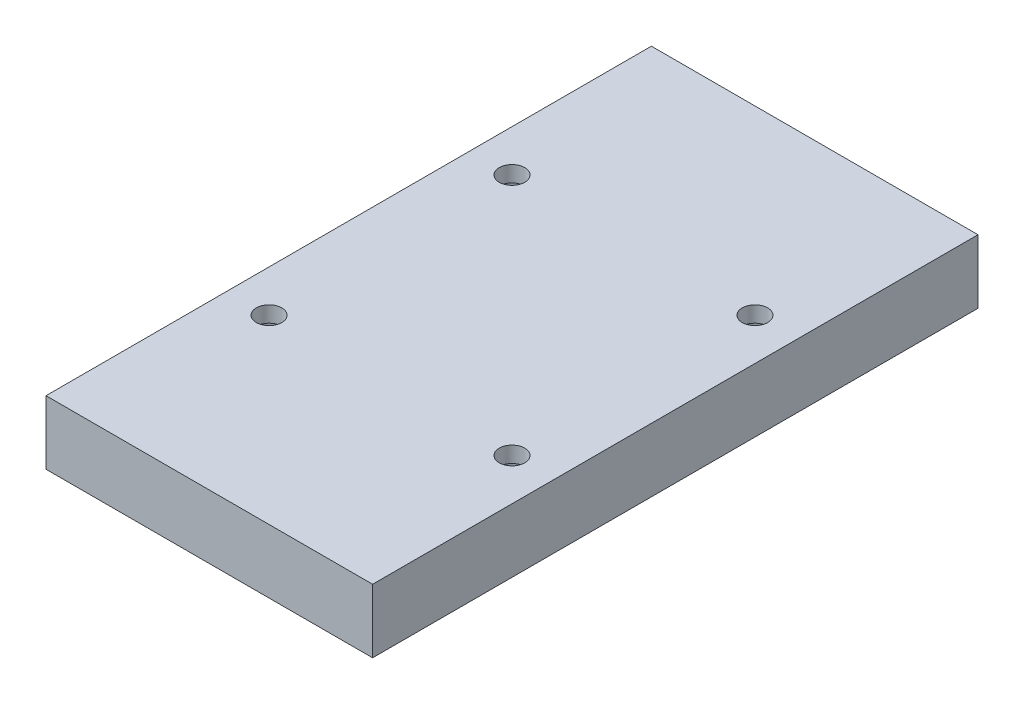
ISO-10303-21;
HEADER;
FILE_DESCRIPTION(('STEP AP214'),'2;1');
FILE_NAME('part.step','',(''),(''),'','','');
FILE_SCHEMA(('AUTOMOTIVE_DESIGN { 1 0 10303 214 1 1 1 1 }'));
ENDSEC;
DATA;
#1=APPLICATION_CONTEXT('core data for automotive mechanical design processes');
#2=APPLICATION_PROTOCOL_DEFINITION('international standard','automotive_design',2000,#1);
#3=PRODUCT_CONTEXT('',#1,'mechanical');
#4=PRODUCT('Part','Part','',(#3));
#5=PRODUCT_RELATED_PRODUCT_CATEGORY('part','',(#4));
#6=PRODUCT_DEFINITION_FORMATION('','',#4);
#7=PRODUCT_DEFINITION_CONTEXT('part definition',#1,'design');
#8=PRODUCT_DEFINITION('design','',#6,#7);
#9=PRODUCT_DEFINITION_SHAPE('','',#8);
#10=(LENGTH_UNIT() NAMED_UNIT(*) SI_UNIT(.MILLI.,.METRE.));
#11=(NAMED_UNIT(*) PLANE_ANGLE_UNIT() SI_UNIT($,.RADIAN.));
#12=(NAMED_UNIT(*) SI_UNIT($,.STERADIAN.) SOLID_ANGLE_UNIT());
#13=UNCERTAINTY_MEASURE_WITH_UNIT(LENGTH_MEASURE(1.E-05),#10,'distance_accuracy_value','');
#14=(GEOMETRIC_REPRESENTATION_CONTEXT(3) GLOBAL_UNCERTAINTY_ASSIGNED_CONTEXT((#13)) GLOBAL_UNIT_ASSIGNED_CONTEXT((#10,
#11,#12)) REPRESENTATION_CONTEXT('',''));
#15=CARTESIAN_POINT('',(0.,0.,0.));
#16=DIRECTION('',(0.,0.,1.));
#17=DIRECTION('',(1.,0.,0.));
#18=AXIS2_PLACEMENT_3D('',#15,#16,#17);
#19=CARTESIAN_POINT('',(17.5,0.,35.));
#20=DIRECTION('',(-1.,0.,0.));
#21=DIRECTION('',(0.,0.,1.));
#22=AXIS2_PLACEMENT_3D('',#19,#20,#21);
#23=PLANE('',#22);
#24=DIRECTION('',(0.,0.,-1.));
#25=VECTOR('',#24,1.);
#26=CARTESIAN_POINT('',(17.5,-5.,-35.));
#27=LINE('',#26,#25);
#28=CARTESIAN_POINT('',(17.5,-5.,13.2656865167016));
#29=VERTEX_POINT('',#28);
#30=CARTESIAN_POINT('',(17.5,-5.,-13.2656865167016));
#31=VERTEX_POINT('',#30);
#32=EDGE_CURVE('E276',#29,#31,#27,.T.);
#33=ORIENTED_EDGE('',*,*,#32,.T.);
#34=DIRECTION('',(0.,1.,0.));
#35=VECTOR('',#34,1.);
#36=CARTESIAN_POINT('',(17.5,-8.,-13.2656865167016));
#37=LINE('',#36,#35);
#38=CARTESIAN_POINT('',(17.5,-8.,-13.2656865167016));
#39=VERTEX_POINT('',#38);
#40=EDGE_CURVE('E309',#31,#39,#37,.F.);
#41=ORIENTED_EDGE('',*,*,#40,.T.);
#42=DIRECTION('',(0.,0.,-1.));
#43=VECTOR('',#42,1.);
#44=CARTESIAN_POINT('',(17.5,-8.,35.));
#45=LINE('',#44,#43);
#46=CARTESIAN_POINT('',(17.5,-8.,13.2656865167016));
#47=VERTEX_POINT('',#46);
#48=EDGE_CURVE('E333',#47,#39,#45,.T.);
#49=ORIENTED_EDGE('',*,*,#48,.F.);
#50=DIRECTION('',(0.,1.,0.));
#51=VECTOR('',#50,1.);
#52=CARTESIAN_POINT('',(17.5,-8.,13.2656865167016));
#53=LINE('',#52,#51);
#54=EDGE_CURVE('E211',#47,#29,#53,.T.);
#55=ORIENTED_EDGE('',*,*,#54,.T.);
#56=EDGE_LOOP('',(#33,#41,#49,#55));
#57=FACE_BOUND('',#56,.T.);
#58=ADVANCED_FACE('F80',(#57),#23,.T.);
#59=CARTESIAN_POINT('',(17.5,-8.,-17.2343134832984));
#60=VERTEX_POINT('',#59);
#61=CARTESIAN_POINT('',(17.5,-8.,-35.));
#62=VERTEX_POINT('',#61);
#63=EDGE_CURVE('E330',#60,#62,#45,.T.);
#64=ORIENTED_EDGE('',*,*,#63,.F.);
#65=DIRECTION('',(0.,1.,0.));
#66=VECTOR('',#65,1.);
#67=CARTESIAN_POINT('',(17.5,-8.,-17.2343134832984));
#68=LINE('',#67,#66);
#69=CARTESIAN_POINT('',(17.5,-5.,-17.2343134832984));
#70=VERTEX_POINT('',#69);
#71=EDGE_CURVE('E303',#60,#70,#68,.T.);
#72=ORIENTED_EDGE('',*,*,#71,.T.);
#73=CARTESIAN_POINT('',(17.5,-5.,-35.));
#74=VERTEX_POINT('',#73);
#75=EDGE_CURVE('E274',#70,#74,#27,.T.);
#76=ORIENTED_EDGE('',*,*,#75,.T.);
#77=DIRECTION('',(0.,-1.,0.));
#78=VECTOR('',#77,1.);
#79=CARTESIAN_POINT('',(17.5,0.,-35.));
#80=LINE('',#79,#78);
#81=EDGE_CURVE('E247',#74,#62,#80,.T.);
#82=ORIENTED_EDGE('',*,*,#81,.T.);
#83=EDGE_LOOP('',(#64,#72,#76,#82));
#84=FACE_BOUND('',#83,.T.);
#85=ADVANCED_FACE('F344',(#84),#23,.T.);
#86=CARTESIAN_POINT('',(17.5,-5.,35.));
#87=VERTEX_POINT('',#86);
#88=CARTESIAN_POINT('',(17.5,-5.,17.2343134832984));
#89=VERTEX_POINT('',#88);
#90=EDGE_CURVE('E89',#87,#89,#27,.T.);
#91=ORIENTED_EDGE('',*,*,#90,.T.);
#92=DIRECTION('',(0.,1.,0.));
#93=VECTOR('',#92,1.);
#94=CARTESIAN_POINT('',(17.5,-8.,17.2343134832984));
#95=LINE('',#94,#93);
#96=CARTESIAN_POINT('',(17.5,-8.,17.2343134832984));
#97=VERTEX_POINT('',#96);
#98=EDGE_CURVE('E300',#89,#97,#95,.F.);
#99=ORIENTED_EDGE('',*,*,#98,.T.);
#100=CARTESIAN_POINT('',(17.5,-8.,35.));
#101=VERTEX_POINT('',#100);
#102=EDGE_CURVE('E331',#101,#97,#45,.T.);
#103=ORIENTED_EDGE('',*,*,#102,.F.);
#104=DIRECTION('',(0.,-1.,0.));
#105=VECTOR('',#104,1.);
#106=CARTESIAN_POINT('',(17.5,0.,35.));
#107=LINE('',#106,#105);
#108=EDGE_CURVE('E240',#87,#101,#107,.T.);
#109=ORIENTED_EDGE('',*,*,#108,.F.);
#110=EDGE_LOOP('',(#91,#99,#103,#109));
#111=FACE_BOUND('',#110,.T.);
#112=ADVANCED_FACE('F365',(#111),#23,.T.);
#113=CARTESIAN_POINT('',(-17.5,0.,-35.));
#114=DIRECTION('',(1.,0.,0.));
#115=DIRECTION('',(0.,0.,-1.));
#116=AXIS2_PLACEMENT_3D('',#113,#114,#115);
#117=PLANE('',#116);
#118=DIRECTION('',(0.,0.,1.));
#119=VECTOR('',#118,1.);
#120=CARTESIAN_POINT('',(-17.5,-5.,-35.));
#121=LINE('',#120,#119);
#122=CARTESIAN_POINT('',(-17.5,-5.,-35.));
#123=VERTEX_POINT('',#122);
#124=CARTESIAN_POINT('',(-17.5,-5.,-17.2343134832984));
#125=VERTEX_POINT('',#124);
#126=EDGE_CURVE('E268',#123,#125,#121,.T.);
#127=ORIENTED_EDGE('',*,*,#126,.T.);
#128=DIRECTION('',(0.,1.,0.));
#129=VECTOR('',#128,1.);
#130=CARTESIAN_POINT('',(-17.5,-8.,-17.2343134832984));
#131=LINE('',#130,#129);
#132=CARTESIAN_POINT('',(-17.5,-8.,-17.2343134832984));
#133=VERTEX_POINT('',#132);
#134=EDGE_CURVE('E316',#125,#133,#131,.F.);
#135=ORIENTED_EDGE('',*,*,#134,.T.);
#136=DIRECTION('',(0.,0.,1.));
#137=VECTOR('',#136,1.);
#138=CARTESIAN_POINT('',(-17.5,-8.,-35.));
#139=LINE('',#138,#137);
#140=CARTESIAN_POINT('',(-17.5,-8.,-35.));
#141=VERTEX_POINT('',#140);
#142=EDGE_CURVE('E218',#141,#133,#139,.T.);
#143=ORIENTED_EDGE('',*,*,#142,.F.);
#144=DIRECTION('',(0.,-1.,0.));
#145=VECTOR('',#144,1.);
#146=CARTESIAN_POINT('',(-17.5,0.,-35.));
#147=LINE('',#146,#145);
#148=EDGE_CURVE('E245',#123,#141,#147,.T.);
#149=ORIENTED_EDGE('',*,*,#148,.F.);
#150=EDGE_LOOP('',(#127,#135,#143,#149));
#151=FACE_BOUND('',#150,.T.);
#152=ADVANCED_FACE('F352',(#151),#117,.T.);
#153=CARTESIAN_POINT('',(-17.5,-8.,-13.2656865167016));
#154=VERTEX_POINT('',#153);
#155=CARTESIAN_POINT('',(-17.5,-8.,13.2656865167016));
#156=VERTEX_POINT('',#155);
#157=EDGE_CURVE('E208',#154,#156,#139,.T.);
#158=ORIENTED_EDGE('',*,*,#157,.F.);
#159=DIRECTION('',(0.,1.,0.));
#160=VECTOR('',#159,1.);
#161=CARTESIAN_POINT('',(-17.5,-8.,-13.2656865167015));
#162=LINE('',#161,#160);
#163=CARTESIAN_POINT('',(-17.5,-5.,-13.2656865167015));
#164=VERTEX_POINT('',#163);
#165=EDGE_CURVE('E105',#154,#164,#162,.T.);
#166=ORIENTED_EDGE('',*,*,#165,.T.);
#167=CARTESIAN_POINT('',(-17.5,-5.,13.2656865167016));
#168=VERTEX_POINT('',#167);
#169=EDGE_CURVE('E210',#164,#168,#121,.T.);
#170=ORIENTED_EDGE('',*,*,#169,.T.);
#171=DIRECTION('',(0.,1.,0.));
#172=VECTOR('',#171,1.);
#173=CARTESIAN_POINT('',(-17.5,-8.,13.2656865167016));
#174=LINE('',#173,#172);
#175=EDGE_CURVE('E196',#168,#156,#174,.F.);
#176=ORIENTED_EDGE('',*,*,#175,.T.);
#177=EDGE_LOOP('',(#158,#166,#170,#176));
#178=FACE_BOUND('',#177,.T.);
#179=ADVANCED_FACE('F207',(#178),#117,.T.);
#180=CARTESIAN_POINT('',(-17.5,-8.,17.2343134832985));
#181=VERTEX_POINT('',#180);
#182=CARTESIAN_POINT('',(-17.5,-8.,35.));
#183=VERTEX_POINT('',#182);
#184=EDGE_CURVE('E219',#181,#183,#139,.T.);
#185=ORIENTED_EDGE('',*,*,#184,.F.);
#186=DIRECTION('',(0.,1.,0.));
#187=VECTOR('',#186,1.);
#188=CARTESIAN_POINT('',(-17.5,-8.,17.2343134832985));
#189=LINE('',#188,#187);
#190=CARTESIAN_POINT('',(-17.5,-5.,17.2343134832985));
#191=VERTEX_POINT('',#190);
#192=EDGE_CURVE('E97',#181,#191,#189,.T.);
#193=ORIENTED_EDGE('',*,*,#192,.T.);
#194=CARTESIAN_POINT('',(-17.5,-5.,35.));
#195=VERTEX_POINT('',#194);
#196=EDGE_CURVE('E267',#191,#195,#121,.T.);
#197=ORIENTED_EDGE('',*,*,#196,.T.);
#198=DIRECTION('',(0.,-1.,0.));
#199=VECTOR('',#198,1.);
#200=CARTESIAN_POINT('',(-17.5,0.,35.));
#201=LINE('',#200,#199);
#202=EDGE_CURVE('E242',#195,#183,#201,.T.);
#203=ORIENTED_EDGE('',*,*,#202,.T.);
#204=EDGE_LOOP('',(#185,#193,#197,#203));
#205=FACE_BOUND('',#204,.T.);
#206=ADVANCED_FACE('F358',(#205),#117,.T.);
#207=CARTESIAN_POINT('',(15.25,-5.,-15.25));
#208=DIRECTION('',(0.,-1.,0.));
#209=DIRECTION('',(0.,0.,-1.));
#210=AXIS2_PLACEMENT_3D('',#207,#208,#209);
#211=CYLINDRICAL_SURFACE('',#210,1.59999999999999);
#212=CARTESIAN_POINT('',(15.25,0.,-15.25));
#213=DIRECTION('',(0.,-1.,0.));
#214=DIRECTION('',(0.,0.,-1.));
#215=AXIS2_PLACEMENT_3D('',#212,#213,#214);
#216=CIRCLE('',#215,1.6);
#217=CARTESIAN_POINT('',(15.25,0.,-16.85));
#218=VERTEX_POINT('',#217);
#219=EDGE_CURVE('E328',#218,#218,#216,.T.);
#220=ORIENTED_EDGE('',*,*,#219,.F.);
#221=EDGE_LOOP('',(#220));
#222=FACE_BOUND('',#221,.T.);
#223=CARTESIAN_POINT('',(15.25,-2.,-15.25));
#224=DIRECTION('',(0.,-1.,0.));
#225=DIRECTION('',(0.,0.,-1.));
#226=AXIS2_PLACEMENT_3D('',#223,#224,#225);
#227=CIRCLE('',#226,1.59999999999999);
#228=CARTESIAN_POINT('',(15.25,-2.,-16.85));
#229=VERTEX_POINT('',#228);
#230=EDGE_CURVE('E84',#229,#229,#227,.F.);
#231=ORIENTED_EDGE('',*,*,#230,.F.);
#232=EDGE_LOOP('',(#231));
#233=FACE_BOUND('',#232,.T.);
#234=ADVANCED_FACE('F418',(#222,#233),#211,.F.);
#235=CARTESIAN_POINT('',(15.25,-5.,15.25));
#236=DIRECTION('',(0.,-1.,0.));
#237=DIRECTION('',(0.,0.,-1.));
#238=AXIS2_PLACEMENT_3D('',#235,#236,#237);
#239=CYLINDRICAL_SURFACE('',#238,1.59999999999999);
#240=CARTESIAN_POINT('',(15.25,0.,15.25));
#241=DIRECTION('',(0.,-1.,0.));
#242=DIRECTION('',(0.,0.,-1.));
#243=AXIS2_PLACEMENT_3D('',#240,#241,#242);
#244=CIRCLE('',#243,1.6);
#245=CARTESIAN_POINT('',(15.25,0.,13.65));
#246=VERTEX_POINT('',#245);
#247=EDGE_CURVE('E325',#246,#246,#244,.T.);
#248=ORIENTED_EDGE('',*,*,#247,.F.);
#249=EDGE_LOOP('',(#248));
#250=FACE_BOUND('',#249,.T.);
#251=CARTESIAN_POINT('',(15.25,-2.,15.25));
#252=DIRECTION('',(0.,-1.,0.));
#253=DIRECTION('',(0.,0.,-1.));
#254=AXIS2_PLACEMENT_3D('',#251,#252,#253);
#255=CIRCLE('',#254,1.59999999999999);
#256=CARTESIAN_POINT('',(15.25,-2.,13.65));
#257=VERTEX_POINT('',#256);
#258=EDGE_CURVE('E282',#257,#257,#255,.F.);
#259=ORIENTED_EDGE('',*,*,#258,.F.);
#260=EDGE_LOOP('',(#259));
#261=FACE_BOUND('',#260,.T.);
#262=ADVANCED_FACE('F422',(#250,#261),#239,.F.);
#263=CARTESIAN_POINT('',(-15.25,-5.,15.25));
#264=DIRECTION('',(0.,-1.,0.));
#265=DIRECTION('',(0.,0.,-1.));
#266=AXIS2_PLACEMENT_3D('',#263,#264,#265);
#267=CYLINDRICAL_SURFACE('',#266,1.59999999999999);
#268=CARTESIAN_POINT('',(-15.25,0.,15.25));
#269=DIRECTION('',(0.,-1.,0.));
#270=DIRECTION('',(0.,0.,-1.));
#271=AXIS2_PLACEMENT_3D('',#268,#269,#270);
#272=CIRCLE('',#271,1.6);
#273=CARTESIAN_POINT('',(-15.25,0.,13.65));
#274=VERTEX_POINT('',#273);
#275=EDGE_CURVE('E322',#274,#274,#272,.T.);
#276=ORIENTED_EDGE('',*,*,#275,.F.);
#277=EDGE_LOOP('',(#276));
#278=FACE_BOUND('',#277,.T.);
#279=CARTESIAN_POINT('',(-15.25,-2.,15.25));
#280=DIRECTION('',(0.,-1.,0.));
#281=DIRECTION('',(0.,0.,-1.));
#282=AXIS2_PLACEMENT_3D('',#279,#280,#281);
#283=CIRCLE('',#282,1.59999999999999);
#284=CARTESIAN_POINT('',(-15.25,-2.,13.65));
#285=VERTEX_POINT('',#284);
#286=EDGE_CURVE('E280',#285,#285,#283,.F.);
#287=ORIENTED_EDGE('',*,*,#286,.F.);
#288=EDGE_LOOP('',(#287));
#289=FACE_BOUND('',#288,.T.);
#290=ADVANCED_FACE('F428',(#278,#289),#267,.F.);
#291=CARTESIAN_POINT('',(-15.25,-5.,-15.25));
#292=DIRECTION('',(0.,-1.,0.));
#293=DIRECTION('',(0.,0.,-1.));
#294=AXIS2_PLACEMENT_3D('',#291,#292,#293);
#295=CYLINDRICAL_SURFACE('',#294,1.59999999999999);
#296=CARTESIAN_POINT('',(-15.25,0.,-15.25));
#297=DIRECTION('',(0.,-1.,0.));
#298=DIRECTION('',(0.,0.,-1.));
#299=AXIS2_PLACEMENT_3D('',#296,#297,#298);
#300=CIRCLE('',#299,1.6);
#301=CARTESIAN_POINT('',(-15.25,0.,-16.85));
#302=VERTEX_POINT('',#301);
#303=EDGE_CURVE('E319',#302,#302,#300,.T.);
#304=ORIENTED_EDGE('',*,*,#303,.F.);
#305=EDGE_LOOP('',(#304));
#306=FACE_BOUND('',#305,.T.);
#307=CARTESIAN_POINT('',(-15.25,-2.,-15.25));
#308=DIRECTION('',(0.,-1.,0.));
#309=DIRECTION('',(0.,0.,-1.));
#310=AXIS2_PLACEMENT_3D('',#307,#308,#309);
#311=CIRCLE('',#310,1.59999999999999);
#312=CARTESIAN_POINT('',(-15.25,-2.,-16.85));
#313=VERTEX_POINT('',#312);
#314=EDGE_CURVE('E201',#313,#313,#311,.F.);
#315=ORIENTED_EDGE('',*,*,#314,.F.);
#316=EDGE_LOOP('',(#315));
#317=FACE_BOUND('',#316,.T.);
#318=ADVANCED_FACE('F460',(#306,#317),#295,.F.);
#319=CARTESIAN_POINT('',(0.,-5.,0.));
#320=DIRECTION('',(0.,-1.,0.));
#321=DIRECTION('',(0.,0.,-1.));
#322=AXIS2_PLACEMENT_3D('',#319,#320,#321);
#323=PLANE('',#322);
#324=ORIENTED_EDGE('',*,*,#169,.F.);
#325=CARTESIAN_POINT('',(-15.25,-5.,-15.25));
#326=DIRECTION('',(0.,-1.,0.));
#327=DIRECTION('',(0.,0.,-1.));
#328=AXIS2_PLACEMENT_3D('',#325,#326,#327);
#329=CIRCLE('',#328,3.);
#330=EDGE_CURVE('E313',#164,#125,#329,.F.);
#331=ORIENTED_EDGE('',*,*,#330,.T.);
#332=ORIENTED_EDGE('',*,*,#126,.F.);
#333=DIRECTION('',(-1.,0.,0.));
#334=VECTOR('',#333,1.);
#335=CARTESIAN_POINT('',(17.5,-5.,-35.));
#336=LINE('',#335,#334);
#337=EDGE_CURVE('E12',#74,#123,#336,.T.);
#338=ORIENTED_EDGE('',*,*,#337,.F.);
#339=ORIENTED_EDGE('',*,*,#75,.F.);
#340=CARTESIAN_POINT('',(15.25,-5.,-15.25));
#341=DIRECTION('',(0.,-1.,0.));
#342=DIRECTION('',(0.,0.,-1.));
#343=AXIS2_PLACEMENT_3D('',#340,#341,#342);
#344=CIRCLE('',#343,3.);
#345=EDGE_CURVE('E306',#70,#31,#344,.F.);
#346=ORIENTED_EDGE('',*,*,#345,.T.);
#347=ORIENTED_EDGE('',*,*,#32,.F.);
#348=CARTESIAN_POINT('',(15.25,-5.,15.25));
#349=DIRECTION('',(0.,-1.,0.));
#350=DIRECTION('',(0.,0.,-1.));
#351=AXIS2_PLACEMENT_3D('',#348,#349,#350);
#352=CIRCLE('',#351,3.);
#353=EDGE_CURVE('E297',#29,#89,#352,.F.);
#354=ORIENTED_EDGE('',*,*,#353,.T.);
#355=ORIENTED_EDGE('',*,*,#90,.F.);
#356=DIRECTION('',(1.,0.,0.));
#357=VECTOR('',#356,1.);
#358=CARTESIAN_POINT('',(17.5,-5.,35.));
#359=LINE('',#358,#357);
#360=EDGE_CURVE('E271',#195,#87,#359,.T.);
#361=ORIENTED_EDGE('',*,*,#360,.F.);
#362=ORIENTED_EDGE('',*,*,#196,.F.);
#363=CARTESIAN_POINT('',(-15.25,-5.,15.25));
#364=DIRECTION('',(0.,-1.,0.));
#365=DIRECTION('',(0.,0.,-1.));
#366=AXIS2_PLACEMENT_3D('',#363,#364,#365);
#367=CIRCLE('',#366,3.);
#368=EDGE_CURVE('E212',#191,#168,#367,.F.);
#369=ORIENTED_EDGE('',*,*,#368,.T.);
#370=EDGE_LOOP('',(#324,#331,#332,#338,#339,#346,#347,#354,#355,#361,#362,#369));
#371=FACE_BOUND('',#370,.T.);
#372=ADVANCED_FACE('F356',(#371),#323,.T.);
#373=CARTESIAN_POINT('',(20.5,0.,35.));
#374=DIRECTION('',(-1.,0.,0.));
#375=DIRECTION('',(0.,0.,1.));
#376=AXIS2_PLACEMENT_3D('',#373,#374,#375);
#377=PLANE('',#376);
#378=DIRECTION('',(0.,-1.,0.));
#379=VECTOR('',#378,1.);
#380=CARTESIAN_POINT('',(20.5,0.,38.));
#381=LINE('',#380,#379);
#382=CARTESIAN_POINT('',(20.5,0.,38.));
#383=VERTEX_POINT('',#382);
#384=CARTESIAN_POINT('',(20.5,-8.,38.));
#385=VERTEX_POINT('',#384);
#386=EDGE_CURVE('E259',#383,#385,#381,.T.);
#387=ORIENTED_EDGE('',*,*,#386,.T.);
#388=DIRECTION('',(0.,0.,-1.));
#389=VECTOR('',#388,1.);
#390=CARTESIAN_POINT('',(20.5,-8.,35.));
#391=LINE('',#390,#389);
#392=CARTESIAN_POINT('',(20.5,-8.,-38.));
#393=VERTEX_POINT('',#392);
#394=EDGE_CURVE('E228',#385,#393,#391,.T.);
#395=ORIENTED_EDGE('',*,*,#394,.T.);
#396=DIRECTION('',(0.,-1.,0.));
#397=VECTOR('',#396,1.);
#398=CARTESIAN_POINT('',(20.5,0.,-38.));
#399=LINE('',#398,#397);
#400=CARTESIAN_POINT('',(20.5,0.,-38.));
#401=VERTEX_POINT('',#400);
#402=EDGE_CURVE('E265',#401,#393,#399,.T.);
#403=ORIENTED_EDGE('',*,*,#402,.F.);
#404=DIRECTION('',(0.,0.,-1.));
#405=VECTOR('',#404,1.);
#406=CARTESIAN_POINT('',(20.5,0.,35.));
#407=LINE('',#406,#405);
#408=EDGE_CURVE('E250',#383,#401,#407,.T.);
#409=ORIENTED_EDGE('',*,*,#408,.F.);
#410=EDGE_LOOP('',(#387,#395,#403,#409));
#411=FACE_BOUND('',#410,.T.);
#412=ADVANCED_FACE('F455',(#411),#377,.F.);
#413=CARTESIAN_POINT('',(17.5,0.,-38.));
#414=DIRECTION('',(0.,0.,1.));
#415=DIRECTION('',(1.,0.,0.));
#416=AXIS2_PLACEMENT_3D('',#413,#414,#415);
#417=PLANE('',#416);
#418=ORIENTED_EDGE('',*,*,#402,.T.);
#419=DIRECTION('',(-1.,0.,0.));
#420=VECTOR('',#419,1.);
#421=CARTESIAN_POINT('',(17.5,-8.,-38.));
#422=LINE('',#421,#420);
#423=CARTESIAN_POINT('',(-20.5,-8.,-38.));
#424=VERTEX_POINT('',#423);
#425=EDGE_CURVE('E231',#393,#424,#422,.T.);
#426=ORIENTED_EDGE('',*,*,#425,.T.);
#427=DIRECTION('',(0.,-1.,0.));
#428=VECTOR('',#427,1.);
#429=CARTESIAN_POINT('',(-20.5,0.,-38.));
#430=LINE('',#429,#428);
#431=CARTESIAN_POINT('',(-20.5,0.,-38.));
#432=VERTEX_POINT('',#431);
#433=EDGE_CURVE('E263',#432,#424,#430,.T.);
#434=ORIENTED_EDGE('',*,*,#433,.F.);
#435=DIRECTION('',(-1.,0.,0.));
#436=VECTOR('',#435,1.);
#437=CARTESIAN_POINT('',(17.5,0.,-38.));
#438=LINE('',#437,#436);
#439=EDGE_CURVE('E253',#401,#432,#438,.T.);
#440=ORIENTED_EDGE('',*,*,#439,.F.);
#441=EDGE_LOOP('',(#418,#426,#434,#440));
#442=FACE_BOUND('',#441,.T.);
#443=ADVANCED_FACE('F449',(#442),#417,.F.);
#444=CARTESIAN_POINT('',(-20.5,0.,-35.));
#445=DIRECTION('',(1.,0.,0.));
#446=DIRECTION('',(0.,0.,-1.));
#447=AXIS2_PLACEMENT_3D('',#444,#445,#446);
#448=PLANE('',#447);
#449=ORIENTED_EDGE('',*,*,#433,.T.);
#450=DIRECTION('',(0.,0.,1.));
#451=VECTOR('',#450,1.);
#452=CARTESIAN_POINT('',(-20.5,-8.,-35.));
#453=LINE('',#452,#451);
#454=CARTESIAN_POINT('',(-20.5,-8.,38.));
#455=VERTEX_POINT('',#454);
#456=EDGE_CURVE('E234',#424,#455,#453,.T.);
#457=ORIENTED_EDGE('',*,*,#456,.T.);
#458=DIRECTION('',(0.,-1.,0.));
#459=VECTOR('',#458,1.);
#460=CARTESIAN_POINT('',(-20.5,0.,38.));
#461=LINE('',#460,#459);
#462=CARTESIAN_POINT('',(-20.5,0.,38.));
#463=VERTEX_POINT('',#462);
#464=EDGE_CURVE('E261',#463,#455,#461,.T.);
#465=ORIENTED_EDGE('',*,*,#464,.F.);
#466=DIRECTION('',(0.,0.,1.));
#467=VECTOR('',#466,1.);
#468=CARTESIAN_POINT('',(-20.5,0.,-35.));
#469=LINE('',#468,#467);
#470=EDGE_CURVE('E255',#432,#463,#469,.T.);
#471=ORIENTED_EDGE('',*,*,#470,.F.);
#472=EDGE_LOOP('',(#449,#457,#465,#471));
#473=FACE_BOUND('',#472,.T.);
#474=ADVANCED_FACE('F444',(#473),#448,.F.);
#475=CARTESIAN_POINT('',(-17.5,0.,38.));
#476=DIRECTION('',(0.,0.,-1.));
#477=DIRECTION('',(-1.,0.,0.));
#478=AXIS2_PLACEMENT_3D('',#475,#476,#477);
#479=PLANE('',#478);
#480=ORIENTED_EDGE('',*,*,#464,.T.);
#481=DIRECTION('',(1.,0.,0.));
#482=VECTOR('',#481,1.);
#483=CARTESIAN_POINT('',(-17.5,-8.,38.));
#484=LINE('',#483,#482);
#485=EDGE_CURVE('E237',#455,#385,#484,.T.);
#486=ORIENTED_EDGE('',*,*,#485,.T.);
#487=ORIENTED_EDGE('',*,*,#386,.F.);
#488=DIRECTION('',(1.,0.,0.));
#489=VECTOR('',#488,1.);
#490=CARTESIAN_POINT('',(-17.5,0.,38.));
#491=LINE('',#490,#489);
#492=EDGE_CURVE('E257',#463,#383,#491,.T.);
#493=ORIENTED_EDGE('',*,*,#492,.F.);
#494=EDGE_LOOP('',(#480,#486,#487,#493));
#495=FACE_BOUND('',#494,.T.);
#496=ADVANCED_FACE('F440',(#495),#479,.F.);
#497=CARTESIAN_POINT('',(17.5,0.,-35.));
#498=DIRECTION('',(0.,0.,1.));
#499=DIRECTION('',(1.,0.,0.));
#500=AXIS2_PLACEMENT_3D('',#497,#498,#499);
#501=PLANE('',#500);
#502=ORIENTED_EDGE('',*,*,#81,.F.);
#503=ORIENTED_EDGE('',*,*,#337,.T.);
#504=ORIENTED_EDGE('',*,*,#148,.T.);
#505=DIRECTION('',(-1.,0.,0.));
#506=VECTOR('',#505,1.);
#507=CARTESIAN_POINT('',(17.5,-8.,-35.));
#508=LINE('',#507,#506);
#509=EDGE_CURVE('E222',#62,#141,#508,.T.);
#510=ORIENTED_EDGE('',*,*,#509,.F.);
#511=EDGE_LOOP('',(#502,#503,#504,#510));
#512=FACE_BOUND('',#511,.T.);
#513=ADVANCED_FACE('F348',(#512),#501,.T.);
#514=CARTESIAN_POINT('',(-17.5,0.,35.));
#515=DIRECTION('',(0.,0.,-1.));
#516=DIRECTION('',(-1.,0.,0.));
#517=AXIS2_PLACEMENT_3D('',#514,#515,#516);
#518=PLANE('',#517);
#519=ORIENTED_EDGE('',*,*,#202,.F.);
#520=ORIENTED_EDGE('',*,*,#360,.T.);
#521=ORIENTED_EDGE('',*,*,#108,.T.);
#522=DIRECTION('',(1.,0.,0.));
#523=VECTOR('',#522,1.);
#524=CARTESIAN_POINT('',(-17.5,-8.,35.));
#525=LINE('',#524,#523);
#526=EDGE_CURVE('E221',#183,#101,#525,.T.);
#527=ORIENTED_EDGE('',*,*,#526,.F.);
#528=EDGE_LOOP('',(#519,#520,#521,#527));
#529=FACE_BOUND('',#528,.T.);
#530=ADVANCED_FACE('F363',(#529),#518,.T.);
#531=CARTESIAN_POINT('',(0.,-8.,0.));
#532=DIRECTION('',(0.,1.,0.));
#533=DIRECTION('',(0.,0.,1.));
#534=AXIS2_PLACEMENT_3D('',#531,#532,#533);
#535=PLANE('',#534);
#536=CARTESIAN_POINT('',(-15.25,-8.,-15.25));
#537=DIRECTION('',(0.,-1.,0.));
#538=DIRECTION('',(0.,0.,-1.));
#539=AXIS2_PLACEMENT_3D('',#536,#537,#538);
#540=CIRCLE('',#539,3.);
#541=EDGE_CURVE('E217',#154,#133,#540,.T.);
#542=ORIENTED_EDGE('',*,*,#541,.F.);
#543=ORIENTED_EDGE('',*,*,#157,.T.);
#544=CARTESIAN_POINT('',(-15.25,-8.,15.25));
#545=DIRECTION('',(0.,-1.,0.));
#546=DIRECTION('',(0.,0.,-1.));
#547=AXIS2_PLACEMENT_3D('',#544,#545,#546);
#548=CIRCLE('',#547,3.);
#549=EDGE_CURVE('E192',#181,#156,#548,.T.);
#550=ORIENTED_EDGE('',*,*,#549,.F.);
#551=ORIENTED_EDGE('',*,*,#184,.T.);
#552=ORIENTED_EDGE('',*,*,#526,.T.);
#553=ORIENTED_EDGE('',*,*,#102,.T.);
#554=CARTESIAN_POINT('',(15.25,-8.,15.25));
#555=DIRECTION('',(0.,-1.,0.));
#556=DIRECTION('',(0.,0.,-1.));
#557=AXIS2_PLACEMENT_3D('',#554,#555,#556);
#558=CIRCLE('',#557,3.);
#559=EDGE_CURVE('E369',#47,#97,#558,.T.);
#560=ORIENTED_EDGE('',*,*,#559,.F.);
#561=ORIENTED_EDGE('',*,*,#48,.T.);
#562=CARTESIAN_POINT('',(15.25,-8.,-15.25));
#563=DIRECTION('',(0.,-1.,0.));
#564=DIRECTION('',(0.,0.,-1.));
#565=AXIS2_PLACEMENT_3D('',#562,#563,#564);
#566=CIRCLE('',#565,3.);
#567=EDGE_CURVE('E341',#60,#39,#566,.T.);
#568=ORIENTED_EDGE('',*,*,#567,.F.);
#569=ORIENTED_EDGE('',*,*,#63,.T.);
#570=ORIENTED_EDGE('',*,*,#509,.T.);
#571=ORIENTED_EDGE('',*,*,#142,.T.);
#572=EDGE_LOOP('',(#542,#543,#550,#551,#552,#553,#560,#561,#568,#569,#570,#571));
#573=FACE_BOUND('',#572,.T.);
#574=ORIENTED_EDGE('',*,*,#394,.F.);
#575=ORIENTED_EDGE('',*,*,#485,.F.);
#576=ORIENTED_EDGE('',*,*,#456,.F.);
#577=ORIENTED_EDGE('',*,*,#425,.F.);
#578=EDGE_LOOP('',(#574,#575,#576,#577));
#579=FACE_BOUND('',#578,.T.);
#580=ADVANCED_FACE('F214',(#573,#579),#535,.F.);
#581=CARTESIAN_POINT('',(0.,0.,0.));
#582=DIRECTION('',(0.,-1.,0.));
#583=DIRECTION('',(0.,0.,-1.));
#584=AXIS2_PLACEMENT_3D('',#581,#582,#583);
#585=PLANE('',#584);
#586=ORIENTED_EDGE('',*,*,#303,.T.);
#587=EDGE_LOOP('',(#586));
#588=FACE_BOUND('',#587,.T.);
#589=ORIENTED_EDGE('',*,*,#275,.T.);
#590=EDGE_LOOP('',(#589));
#591=FACE_BOUND('',#590,.T.);
#592=ORIENTED_EDGE('',*,*,#247,.T.);
#593=EDGE_LOOP('',(#592));
#594=FACE_BOUND('',#593,.T.);
#595=ORIENTED_EDGE('',*,*,#219,.T.);
#596=EDGE_LOOP('',(#595));
#597=FACE_BOUND('',#596,.T.);
#598=ORIENTED_EDGE('',*,*,#408,.T.);
#599=ORIENTED_EDGE('',*,*,#439,.T.);
#600=ORIENTED_EDGE('',*,*,#470,.T.);
#601=ORIENTED_EDGE('',*,*,#492,.T.);
#602=EDGE_LOOP('',(#598,#599,#600,#601));
#603=FACE_BOUND('',#602,.T.);
#604=ADVANCED_FACE('F82',(#588,#591,#594,#597,#603),#585,.F.);
#605=CARTESIAN_POINT('',(-15.25,-2.,-15.25));
#606=DIRECTION('',(0.,-1.,0.));
#607=DIRECTION('',(0.,0.,-1.));
#608=AXIS2_PLACEMENT_3D('',#605,#606,#607);
#609=PLANE('',#608);
#610=CARTESIAN_POINT('',(-15.25,-2.,-15.25));
#611=DIRECTION('',(0.,-1.,0.));
#612=DIRECTION('',(0.,0.,-1.));
#613=AXIS2_PLACEMENT_3D('',#610,#611,#612);
#614=CIRCLE('',#613,3.);
#615=CARTESIAN_POINT('',(-15.25,-2.,-18.25));
#616=VERTEX_POINT('',#615);
#617=EDGE_CURVE('E384',#616,#616,#614,.T.);
#618=ORIENTED_EDGE('',*,*,#617,.T.);
#619=EDGE_LOOP('',(#618));
#620=FACE_BOUND('',#619,.T.);
#621=ORIENTED_EDGE('',*,*,#314,.T.);
#622=EDGE_LOOP('',(#621));
#623=FACE_BOUND('',#622,.T.);
#624=ADVANCED_FACE('F389',(#620,#623),#609,.T.);
#625=CARTESIAN_POINT('',(-15.25,-8.,-15.25));
#626=DIRECTION('',(0.,1.,0.));
#627=DIRECTION('',(0.,0.,1.));
#628=AXIS2_PLACEMENT_3D('',#625,#626,#627);
#629=CYLINDRICAL_SURFACE('',#628,3.);
#630=ORIENTED_EDGE('',*,*,#330,.F.);
#631=ORIENTED_EDGE('',*,*,#165,.F.);
#632=ORIENTED_EDGE('',*,*,#541,.T.);
#633=ORIENTED_EDGE('',*,*,#134,.F.);
#634=EDGE_LOOP('',(#630,#631,#632,#633));
#635=FACE_BOUND('',#634,.T.);
#636=ORIENTED_EDGE('',*,*,#617,.F.);
#637=EDGE_LOOP('',(#636));
#638=FACE_BOUND('',#637,.T.);
#639=ADVANCED_FACE('F353',(#635,#638),#629,.F.);
#640=CARTESIAN_POINT('',(-15.25,-2.,15.25));
#641=DIRECTION('',(0.,-1.,0.));
#642=DIRECTION('',(0.,0.,-1.));
#643=AXIS2_PLACEMENT_3D('',#640,#641,#642);
#644=PLANE('',#643);
#645=CARTESIAN_POINT('',(-15.25,-2.,15.25));
#646=DIRECTION('',(0.,-1.,0.));
#647=DIRECTION('',(0.,0.,-1.));
#648=AXIS2_PLACEMENT_3D('',#645,#646,#647);
#649=CIRCLE('',#648,3.);
#650=CARTESIAN_POINT('',(-15.25,-2.,12.25));
#651=VERTEX_POINT('',#650);
#652=EDGE_CURVE('E202',#651,#651,#649,.T.);
#653=ORIENTED_EDGE('',*,*,#652,.T.);
#654=EDGE_LOOP('',(#653));
#655=FACE_BOUND('',#654,.T.);
#656=ORIENTED_EDGE('',*,*,#286,.T.);
#657=EDGE_LOOP('',(#656));
#658=FACE_BOUND('',#657,.T.);
#659=ADVANCED_FACE('F392',(#655,#658),#644,.T.);
#660=CARTESIAN_POINT('',(-15.25,-8.,15.25));
#661=DIRECTION('',(0.,1.,0.));
#662=DIRECTION('',(0.,0.,1.));
#663=AXIS2_PLACEMENT_3D('',#660,#661,#662);
#664=CYLINDRICAL_SURFACE('',#663,3.);
#665=ORIENTED_EDGE('',*,*,#368,.F.);
#666=ORIENTED_EDGE('',*,*,#192,.F.);
#667=ORIENTED_EDGE('',*,*,#549,.T.);
#668=ORIENTED_EDGE('',*,*,#175,.F.);
#669=EDGE_LOOP('',(#665,#666,#667,#668));
#670=FACE_BOUND('',#669,.T.);
#671=ORIENTED_EDGE('',*,*,#652,.F.);
#672=EDGE_LOOP('',(#671));
#673=FACE_BOUND('',#672,.T.);
#674=ADVANCED_FACE('F194',(#670,#673),#664,.F.);
#675=CARTESIAN_POINT('',(15.25,-2.,15.25));
#676=DIRECTION('',(0.,-1.,0.));
#677=DIRECTION('',(0.,0.,-1.));
#678=AXIS2_PLACEMENT_3D('',#675,#676,#677);
#679=PLANE('',#678);
#680=CARTESIAN_POINT('',(15.25,-2.,15.25));
#681=DIRECTION('',(0.,-1.,0.));
#682=DIRECTION('',(0.,0.,-1.));
#683=AXIS2_PLACEMENT_3D('',#680,#681,#682);
#684=CIRCLE('',#683,3.);
#685=CARTESIAN_POINT('',(15.25,-2.,12.25));
#686=VERTEX_POINT('',#685);
#687=EDGE_CURVE('E374',#686,#686,#684,.T.);
#688=ORIENTED_EDGE('',*,*,#687,.T.);
#689=EDGE_LOOP('',(#688));
#690=FACE_BOUND('',#689,.T.);
#691=ORIENTED_EDGE('',*,*,#258,.T.);
#692=EDGE_LOOP('',(#691));
#693=FACE_BOUND('',#692,.T.);
#694=ADVANCED_FACE('F474',(#690,#693),#679,.T.);
#695=CARTESIAN_POINT('',(15.25,-8.,15.25));
#696=DIRECTION('',(0.,1.,0.));
#697=DIRECTION('',(0.,0.,1.));
#698=AXIS2_PLACEMENT_3D('',#695,#696,#697);
#699=CYLINDRICAL_SURFACE('',#698,3.);
#700=ORIENTED_EDGE('',*,*,#353,.F.);
#701=ORIENTED_EDGE('',*,*,#54,.F.);
#702=ORIENTED_EDGE('',*,*,#559,.T.);
#703=ORIENTED_EDGE('',*,*,#98,.F.);
#704=EDGE_LOOP('',(#700,#701,#702,#703));
#705=FACE_BOUND('',#704,.T.);
#706=ORIENTED_EDGE('',*,*,#687,.F.);
#707=EDGE_LOOP('',(#706));
#708=FACE_BOUND('',#707,.T.);
#709=ADVANCED_FACE('F367',(#705,#708),#699,.F.);
#710=CARTESIAN_POINT('',(15.25,-2.,-15.25));
#711=DIRECTION('',(0.,-1.,0.));
#712=DIRECTION('',(0.,0.,-1.));
#713=AXIS2_PLACEMENT_3D('',#710,#711,#712);
#714=PLANE('',#713);
#715=CARTESIAN_POINT('',(15.25,-2.,-15.25));
#716=DIRECTION('',(0.,-1.,0.));
#717=DIRECTION('',(0.,0.,-1.));
#718=AXIS2_PLACEMENT_3D('',#715,#716,#717);
#719=CIRCLE('',#718,3.);
#720=CARTESIAN_POINT('',(15.25,-2.,-18.25));
#721=VERTEX_POINT('',#720);
#722=EDGE_CURVE('E380',#721,#721,#719,.T.);
#723=ORIENTED_EDGE('',*,*,#722,.T.);
#724=EDGE_LOOP('',(#723));
#725=FACE_BOUND('',#724,.T.);
#726=ORIENTED_EDGE('',*,*,#230,.T.);
#727=EDGE_LOOP('',(#726));
#728=FACE_BOUND('',#727,.T.);
#729=ADVANCED_FACE('F483',(#725,#728),#714,.T.);
#730=CARTESIAN_POINT('',(15.25,-8.,-15.25));
#731=DIRECTION('',(0.,1.,0.));
#732=DIRECTION('',(0.,0.,1.));
#733=AXIS2_PLACEMENT_3D('',#730,#731,#732);
#734=CYLINDRICAL_SURFACE('',#733,3.);
#735=ORIENTED_EDGE('',*,*,#345,.F.);
#736=ORIENTED_EDGE('',*,*,#71,.F.);
#737=ORIENTED_EDGE('',*,*,#567,.T.);
#738=ORIENTED_EDGE('',*,*,#40,.F.);
#739=EDGE_LOOP('',(#735,#736,#737,#738));
#740=FACE_BOUND('',#739,.T.);
#741=ORIENTED_EDGE('',*,*,#722,.F.);
#742=EDGE_LOOP('',(#741));
#743=FACE_BOUND('',#742,.T.);
#744=ADVANCED_FACE('F488',(#740,#743),#734,.F.);
#745=CLOSED_SHELL('',(#58,#85,#112,#152,#179,#206,#234,#262,#290,#318,#372,#412,#443,#474,#496,
#513,#530,#580,#604,#624,#639,#659,#674,#694,#709,#729,#744));
#746=MANIFOLD_SOLID_BREP('B2',#745);
#747=ADVANCED_BREP_SHAPE_REPRESENTATION('',(#18,#746),#14);
#748=SHAPE_DEFINITION_REPRESENTATION(#9,#747);
ENDSEC;
END-ISO-10303-21;
